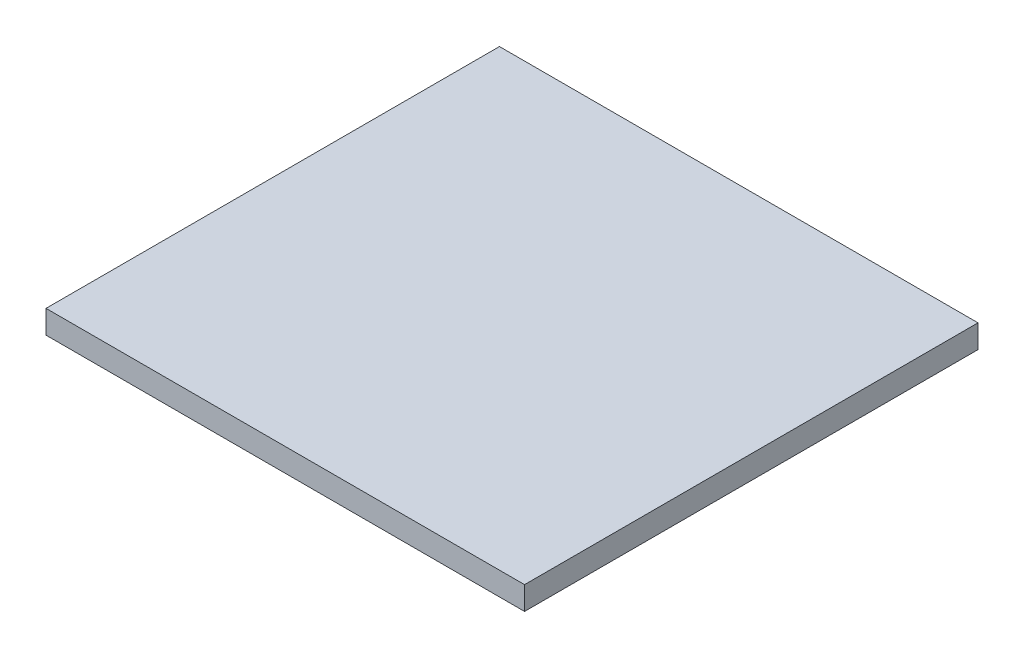
ISO-10303-21;
HEADER;
FILE_DESCRIPTION(('STEP AP214'),'2;1');
FILE_NAME('part.step','',(''),(''),'','','');
FILE_SCHEMA(('AUTOMOTIVE_DESIGN { 1 0 10303 214 1 1 1 1 }'));
ENDSEC;
DATA;
#1=APPLICATION_CONTEXT('core data for automotive mechanical design processes');
#2=APPLICATION_PROTOCOL_DEFINITION('international standard','automotive_design',2000,#1);
#3=PRODUCT_CONTEXT('',#1,'mechanical');
#4=PRODUCT('Part','Part','',(#3));
#5=PRODUCT_RELATED_PRODUCT_CATEGORY('part','',(#4));
#6=PRODUCT_DEFINITION_FORMATION('','',#4);
#7=PRODUCT_DEFINITION_CONTEXT('part definition',#1,'design');
#8=PRODUCT_DEFINITION('design','',#6,#7);
#9=PRODUCT_DEFINITION_SHAPE('','',#8);
#10=(LENGTH_UNIT() NAMED_UNIT(*) SI_UNIT(.MILLI.,.METRE.));
#11=(NAMED_UNIT(*) PLANE_ANGLE_UNIT() SI_UNIT($,.RADIAN.));
#12=(NAMED_UNIT(*) SI_UNIT($,.STERADIAN.) SOLID_ANGLE_UNIT());
#13=UNCERTAINTY_MEASURE_WITH_UNIT(LENGTH_MEASURE(1.E-05),#10,'distance_accuracy_value','');
#14=(GEOMETRIC_REPRESENTATION_CONTEXT(3) GLOBAL_UNCERTAINTY_ASSIGNED_CONTEXT((#13)) GLOBAL_UNIT_ASSIGNED_CONTEXT((#10,
#11,#12)) REPRESENTATION_CONTEXT('',''));
#15=CARTESIAN_POINT('',(0.,0.,0.));
#16=DIRECTION('',(0.,0.,1.));
#17=DIRECTION('',(1.,0.,0.));
#18=AXIS2_PLACEMENT_3D('',#15,#16,#17);
#19=CARTESIAN_POINT('',(-65.9453416149068,6.35,-79.2259130434782));
#20=DIRECTION('',(1.,0.,0.));
#21=DIRECTION('',(0.,0.,-1.));
#22=AXIS2_PLACEMENT_3D('',#19,#20,#21);
#23=PLANE('',#22);
#24=DIRECTION('',(0.,0.,1.));
#25=VECTOR('',#24,1.);
#26=CARTESIAN_POINT('',(-65.9453416149068,0.,-79.2259130434782));
#27=LINE('',#26,#25);
#28=CARTESIAN_POINT('',(-65.9453416149068,0.,-79.2259130434782));
#29=VERTEX_POINT('',#28);
#30=CARTESIAN_POINT('',(-65.9453416149068,0.,44.7260869565218));
#31=VERTEX_POINT('',#30);
#32=EDGE_CURVE('E96',#29,#31,#27,.T.);
#33=ORIENTED_EDGE('',*,*,#32,.T.);
#34=DIRECTION('',(0.,-1.,0.));
#35=VECTOR('',#34,1.);
#36=CARTESIAN_POINT('',(-65.9453416149068,6.35,44.7260869565218));
#37=LINE('',#36,#35);
#38=CARTESIAN_POINT('',(-65.9453416149068,6.35,44.7260869565218));
#39=VERTEX_POINT('',#38);
#40=EDGE_CURVE('E11',#39,#31,#37,.T.);
#41=ORIENTED_EDGE('',*,*,#40,.F.);
#42=DIRECTION('',(0.,0.,1.));
#43=VECTOR('',#42,1.);
#44=CARTESIAN_POINT('',(-65.9453416149068,6.35,-79.2259130434782));
#45=LINE('',#44,#43);
#46=CARTESIAN_POINT('',(-65.9453416149068,6.35,-79.2259130434782));
#47=VERTEX_POINT('',#46);
#48=EDGE_CURVE('E84',#47,#39,#45,.T.);
#49=ORIENTED_EDGE('',*,*,#48,.F.);
#50=DIRECTION('',(0.,-1.,0.));
#51=VECTOR('',#50,1.);
#52=CARTESIAN_POINT('',(-65.9453416149068,6.35,-79.2259130434782));
#53=LINE('',#52,#51);
#54=EDGE_CURVE('E92',#47,#29,#53,.T.);
#55=ORIENTED_EDGE('',*,*,#54,.T.);
#56=EDGE_LOOP('',(#33,#41,#49,#55));
#57=FACE_BOUND('',#56,.T.);
#58=ADVANCED_FACE('F33',(#57),#23,.F.);
#59=CARTESIAN_POINT('',(-65.9453416149068,6.35,44.7260869565218));
#60=DIRECTION('',(0.,0.,-1.));
#61=DIRECTION('',(-1.,0.,0.));
#62=AXIS2_PLACEMENT_3D('',#59,#60,#61);
#63=PLANE('',#62);
#64=DIRECTION('',(1.,0.,0.));
#65=VECTOR('',#64,1.);
#66=CARTESIAN_POINT('',(-65.9453416149068,0.,44.7260869565218));
#67=LINE('',#66,#65);
#68=CARTESIAN_POINT('',(64.8646583850932,0.,44.7260869565218));
#69=VERTEX_POINT('',#68);
#70=EDGE_CURVE('E88',#31,#69,#67,.T.);
#71=ORIENTED_EDGE('',*,*,#70,.T.);
#72=DIRECTION('',(0.,-1.,0.));
#73=VECTOR('',#72,1.);
#74=CARTESIAN_POINT('',(64.8646583850932,6.35,44.7260869565218));
#75=LINE('',#74,#73);
#76=CARTESIAN_POINT('',(64.8646583850932,6.35,44.7260869565218));
#77=VERTEX_POINT('',#76);
#78=EDGE_CURVE('E41',#77,#69,#75,.T.);
#79=ORIENTED_EDGE('',*,*,#78,.F.);
#80=DIRECTION('',(1.,0.,0.));
#81=VECTOR('',#80,1.);
#82=CARTESIAN_POINT('',(-65.9453416149068,6.35,44.7260869565218));
#83=LINE('',#82,#81);
#84=EDGE_CURVE('E79',#39,#77,#83,.T.);
#85=ORIENTED_EDGE('',*,*,#84,.F.);
#86=ORIENTED_EDGE('',*,*,#40,.T.);
#87=EDGE_LOOP('',(#71,#79,#85,#86));
#88=FACE_BOUND('',#87,.T.);
#89=ADVANCED_FACE('F87',(#88),#63,.F.);
#90=CARTESIAN_POINT('',(64.8646583850932,6.35,-79.2259130434782));
#91=DIRECTION('',(-1.,0.,0.));
#92=DIRECTION('',(0.,0.,1.));
#93=AXIS2_PLACEMENT_3D('',#90,#91,#92);
#94=PLANE('',#93);
#95=DIRECTION('',(0.,0.,-1.));
#96=VECTOR('',#95,1.);
#97=CARTESIAN_POINT('',(64.8646583850932,0.,-79.2259130434782));
#98=LINE('',#97,#96);
#99=CARTESIAN_POINT('',(64.8646583850932,0.,-79.2259130434782));
#100=VERTEX_POINT('',#99);
#101=EDGE_CURVE('E66',#69,#100,#98,.T.);
#102=ORIENTED_EDGE('',*,*,#101,.T.);
#103=DIRECTION('',(0.,-1.,0.));
#104=VECTOR('',#103,1.);
#105=CARTESIAN_POINT('',(64.8646583850932,6.35,-79.2259130434782));
#106=LINE('',#105,#104);
#107=CARTESIAN_POINT('',(64.8646583850932,6.35,-79.2259130434782));
#108=VERTEX_POINT('',#107);
#109=EDGE_CURVE('E89',#108,#100,#106,.T.);
#110=ORIENTED_EDGE('',*,*,#109,.F.);
#111=DIRECTION('',(0.,0.,-1.));
#112=VECTOR('',#111,1.);
#113=CARTESIAN_POINT('',(64.8646583850932,6.35,-79.2259130434782));
#114=LINE('',#113,#112);
#115=EDGE_CURVE('E82',#77,#108,#114,.T.);
#116=ORIENTED_EDGE('',*,*,#115,.F.);
#117=ORIENTED_EDGE('',*,*,#78,.T.);
#118=EDGE_LOOP('',(#102,#110,#116,#117));
#119=FACE_BOUND('',#118,.T.);
#120=ADVANCED_FACE('F90',(#119),#94,.F.);
#121=CARTESIAN_POINT('',(-65.9453416149068,6.35,-79.2259130434782));
#122=DIRECTION('',(0.,0.,1.));
#123=DIRECTION('',(1.,0.,0.));
#124=AXIS2_PLACEMENT_3D('',#121,#122,#123);
#125=PLANE('',#124);
#126=DIRECTION('',(-1.,0.,0.));
#127=VECTOR('',#126,1.);
#128=CARTESIAN_POINT('',(-65.9453416149068,0.,-79.2259130434782));
#129=LINE('',#128,#127);
#130=EDGE_CURVE('E72',#100,#29,#129,.T.);
#131=ORIENTED_EDGE('',*,*,#130,.T.);
#132=ORIENTED_EDGE('',*,*,#54,.F.);
#133=DIRECTION('',(-1.,0.,0.));
#134=VECTOR('',#133,1.);
#135=CARTESIAN_POINT('',(-65.9453416149068,6.35,-79.2259130434782));
#136=LINE('',#135,#134);
#137=EDGE_CURVE('E49',#108,#47,#136,.T.);
#138=ORIENTED_EDGE('',*,*,#137,.F.);
#139=ORIENTED_EDGE('',*,*,#109,.T.);
#140=EDGE_LOOP('',(#131,#132,#138,#139));
#141=FACE_BOUND('',#140,.T.);
#142=ADVANCED_FACE('F103',(#141),#125,.F.);
#143=CARTESIAN_POINT('',(0.,6.35,0.));
#144=DIRECTION('',(0.,1.,0.));
#145=DIRECTION('',(0.,0.,1.));
#146=AXIS2_PLACEMENT_3D('',#143,#144,#145);
#147=PLANE('',#146);
#148=ORIENTED_EDGE('',*,*,#48,.T.);
#149=ORIENTED_EDGE('',*,*,#84,.T.);
#150=ORIENTED_EDGE('',*,*,#115,.T.);
#151=ORIENTED_EDGE('',*,*,#137,.T.);
#152=EDGE_LOOP('',(#148,#149,#150,#151));
#153=FACE_BOUND('',#152,.T.);
#154=ADVANCED_FACE('F80',(#153),#147,.T.);
#155=CARTESIAN_POINT('',(0.,0.,0.));
#156=DIRECTION('',(0.,1.,0.));
#157=DIRECTION('',(0.,0.,1.));
#158=AXIS2_PLACEMENT_3D('',#155,#156,#157);
#159=PLANE('',#158);
#160=ORIENTED_EDGE('',*,*,#32,.F.);
#161=ORIENTED_EDGE('',*,*,#130,.F.);
#162=ORIENTED_EDGE('',*,*,#101,.F.);
#163=ORIENTED_EDGE('',*,*,#70,.F.);
#164=EDGE_LOOP('',(#160,#161,#162,#163));
#165=FACE_BOUND('',#164,.T.);
#166=ADVANCED_FACE('F106',(#165),#159,.F.);
#167=CLOSED_SHELL('',(#58,#89,#120,#142,#154,#166));
#168=MANIFOLD_SOLID_BREP('B2',#167);
#169=ADVANCED_BREP_SHAPE_REPRESENTATION('',(#18,#168),#14);
#170=SHAPE_DEFINITION_REPRESENTATION(#9,#169);
ENDSEC;
END-ISO-10303-21;
